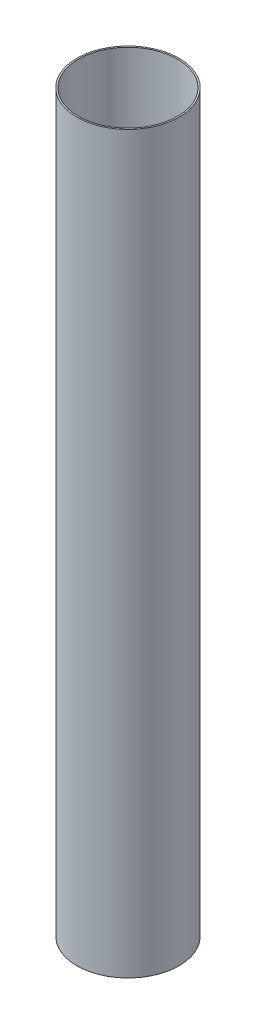
ISO-10303-21;
HEADER;
FILE_DESCRIPTION(('STEP AP214'),'2;1');
FILE_NAME('part.step','',(''),(''),'','','');
FILE_SCHEMA(('AUTOMOTIVE_DESIGN { 1 0 10303 214 1 1 1 1 }'));
ENDSEC;
DATA;
#1=APPLICATION_CONTEXT('core data for automotive mechanical design processes');
#2=APPLICATION_PROTOCOL_DEFINITION('international standard','automotive_design',2000,#1);
#3=PRODUCT_CONTEXT('',#1,'mechanical');
#4=PRODUCT('Part','Part','',(#3));
#5=PRODUCT_RELATED_PRODUCT_CATEGORY('part','',(#4));
#6=PRODUCT_DEFINITION_FORMATION('','',#4);
#7=PRODUCT_DEFINITION_CONTEXT('part definition',#1,'design');
#8=PRODUCT_DEFINITION('design','',#6,#7);
#9=PRODUCT_DEFINITION_SHAPE('','',#8);
#10=(LENGTH_UNIT() NAMED_UNIT(*) SI_UNIT(.MILLI.,.METRE.));
#11=(NAMED_UNIT(*) PLANE_ANGLE_UNIT() SI_UNIT($,.RADIAN.));
#12=(NAMED_UNIT(*) SI_UNIT($,.STERADIAN.) SOLID_ANGLE_UNIT());
#13=UNCERTAINTY_MEASURE_WITH_UNIT(LENGTH_MEASURE(1.E-05),#10,'distance_accuracy_value','');
#14=(GEOMETRIC_REPRESENTATION_CONTEXT(3) GLOBAL_UNCERTAINTY_ASSIGNED_CONTEXT((#13)) GLOBAL_UNIT_ASSIGNED_CONTEXT((#10,
#11,#12)) REPRESENTATION_CONTEXT('',''));
#15=CARTESIAN_POINT('',(0.,0.,0.));
#16=DIRECTION('',(0.,0.,1.));
#17=DIRECTION('',(1.,0.,0.));
#18=AXIS2_PLACEMENT_3D('',#15,#16,#17);
#19=CARTESIAN_POINT('',(0.,482.,0.));
#20=DIRECTION('',(0.,1.,0.));
#21=DIRECTION('',(0.,0.,1.));
#22=AXIS2_PLACEMENT_3D('',#19,#20,#21);
#23=PLANE('',#22);
#24=CARTESIAN_POINT('',(0.,482.,0.));
#25=DIRECTION('',(0.,1.,0.));
#26=DIRECTION('',(0.,0.,1.));
#27=AXIS2_PLACEMENT_3D('',#24,#25,#26);
#28=CIRCLE('',#27,33.5);
#29=CARTESIAN_POINT('',(0.,482.,33.5));
#30=VERTEX_POINT('',#29);
#31=EDGE_CURVE('E10',#30,#30,#28,.T.);
#32=ORIENTED_EDGE('',*,*,#31,.T.);
#33=EDGE_LOOP('',(#32));
#34=FACE_BOUND('',#33,.T.);
#35=CARTESIAN_POINT('',(0.,482.,0.));
#36=DIRECTION('',(0.,1.,0.));
#37=DIRECTION('',(0.,0.,1.));
#38=AXIS2_PLACEMENT_3D('',#35,#36,#37);
#39=CIRCLE('',#38,32.5);
#40=CARTESIAN_POINT('',(0.,482.,32.5));
#41=VERTEX_POINT('',#40);
#42=EDGE_CURVE('E50',#41,#41,#39,.T.);
#43=ORIENTED_EDGE('',*,*,#42,.F.);
#44=EDGE_LOOP('',(#43));
#45=FACE_BOUND('',#44,.T.);
#46=ADVANCED_FACE('F37',(#34,#45),#23,.T.);
#47=CARTESIAN_POINT('',(0.,0.,0.));
#48=DIRECTION('',(0.,1.,0.));
#49=DIRECTION('',(0.,0.,1.));
#50=AXIS2_PLACEMENT_3D('',#47,#48,#49);
#51=PLANE('',#50);
#52=CARTESIAN_POINT('',(0.,0.,0.));
#53=DIRECTION('',(0.,1.,0.));
#54=DIRECTION('',(0.,0.,1.));
#55=AXIS2_PLACEMENT_3D('',#52,#53,#54);
#56=CIRCLE('',#55,33.5);
#57=CARTESIAN_POINT('',(0.,0.,33.5));
#58=VERTEX_POINT('',#57);
#59=EDGE_CURVE('E41',#58,#58,#56,.T.);
#60=ORIENTED_EDGE('',*,*,#59,.F.);
#61=EDGE_LOOP('',(#60));
#62=FACE_BOUND('',#61,.T.);
#63=CARTESIAN_POINT('',(0.,0.,0.));
#64=DIRECTION('',(0.,1.,0.));
#65=DIRECTION('',(0.,0.,1.));
#66=AXIS2_PLACEMENT_3D('',#63,#64,#65);
#67=CIRCLE('',#66,32.5);
#68=CARTESIAN_POINT('',(0.,0.,32.5));
#69=VERTEX_POINT('',#68);
#70=EDGE_CURVE('E52',#69,#69,#67,.T.);
#71=ORIENTED_EDGE('',*,*,#70,.T.);
#72=EDGE_LOOP('',(#71));
#73=FACE_BOUND('',#72,.T.);
#74=ADVANCED_FACE('F64',(#62,#73),#51,.F.);
#75=CARTESIAN_POINT('',(0.,482.,0.));
#76=DIRECTION('',(0.,-1.,0.));
#77=DIRECTION('',(0.,0.,-1.));
#78=AXIS2_PLACEMENT_3D('',#75,#76,#77);
#79=CYLINDRICAL_SURFACE('',#78,33.5);
#80=ORIENTED_EDGE('',*,*,#31,.F.);
#81=EDGE_LOOP('',(#80));
#82=FACE_BOUND('',#81,.T.);
#83=ORIENTED_EDGE('',*,*,#59,.T.);
#84=EDGE_LOOP('',(#83));
#85=FACE_BOUND('',#84,.T.);
#86=ADVANCED_FACE('F39',(#82,#85),#79,.T.);
#87=CARTESIAN_POINT('',(0.,482.,0.));
#88=DIRECTION('',(0.,-1.,0.));
#89=DIRECTION('',(0.,0.,-1.));
#90=AXIS2_PLACEMENT_3D('',#87,#88,#89);
#91=CYLINDRICAL_SURFACE('',#90,32.5);
#92=ORIENTED_EDGE('',*,*,#42,.T.);
#93=EDGE_LOOP('',(#92));
#94=FACE_BOUND('',#93,.T.);
#95=ORIENTED_EDGE('',*,*,#70,.F.);
#96=EDGE_LOOP('',(#95));
#97=FACE_BOUND('',#96,.T.);
#98=ADVANCED_FACE('F60',(#94,#97),#91,.F.);
#99=CLOSED_SHELL('',(#46,#74,#86,#98));
#100=MANIFOLD_SOLID_BREP('B2',#99);
#101=ADVANCED_BREP_SHAPE_REPRESENTATION('',(#18,#100),#14);
#102=SHAPE_DEFINITION_REPRESENTATION(#9,#101);
ENDSEC;
END-ISO-10303-21;
